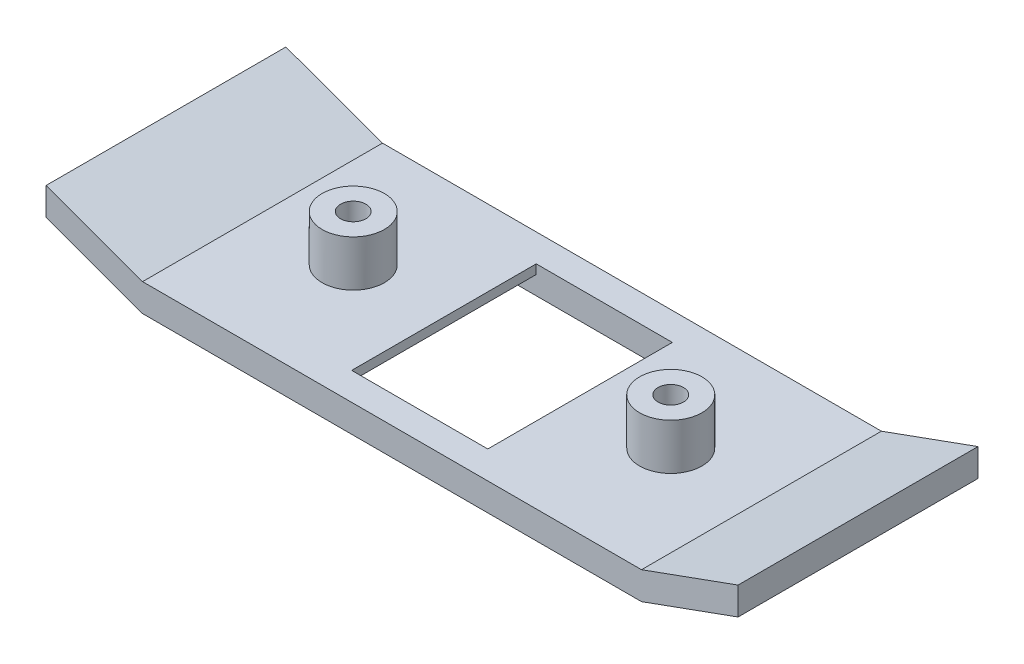
ISO-10303-21;
HEADER;
FILE_DESCRIPTION(('STEP AP214'),'2;1');
FILE_NAME('part.step','',(''),(''),'','','');
FILE_SCHEMA(('AUTOMOTIVE_DESIGN { 1 0 10303 214 1 1 1 1 }'));
ENDSEC;
DATA;
#1=APPLICATION_CONTEXT('core data for automotive mechanical design processes');
#2=APPLICATION_PROTOCOL_DEFINITION('international standard','automotive_design',2000,#1);
#3=PRODUCT_CONTEXT('',#1,'mechanical');
#4=PRODUCT('Part','Part','',(#3));
#5=PRODUCT_RELATED_PRODUCT_CATEGORY('part','',(#4));
#6=PRODUCT_DEFINITION_FORMATION('','',#4);
#7=PRODUCT_DEFINITION_CONTEXT('part definition',#1,'design');
#8=PRODUCT_DEFINITION('design','',#6,#7);
#9=PRODUCT_DEFINITION_SHAPE('','',#8);
#10=(LENGTH_UNIT() NAMED_UNIT(*) SI_UNIT(.MILLI.,.METRE.));
#11=(NAMED_UNIT(*) PLANE_ANGLE_UNIT() SI_UNIT($,.RADIAN.));
#12=(NAMED_UNIT(*) SI_UNIT($,.STERADIAN.) SOLID_ANGLE_UNIT());
#13=UNCERTAINTY_MEASURE_WITH_UNIT(LENGTH_MEASURE(1.E-05),#10,'distance_accuracy_value','');
#14=(GEOMETRIC_REPRESENTATION_CONTEXT(3) GLOBAL_UNCERTAINTY_ASSIGNED_CONTEXT((#13)) GLOBAL_UNIT_ASSIGNED_CONTEXT((#10,
#11,#12)) REPRESENTATION_CONTEXT('',''));
#15=CARTESIAN_POINT('',(0.,0.,0.));
#16=DIRECTION('',(0.,0.,1.));
#17=DIRECTION('',(1.,0.,0.));
#18=AXIS2_PLACEMENT_3D('',#15,#16,#17);
#19=CARTESIAN_POINT('',(-27.035253751749,3.,102.306789568928));
#20=DIRECTION('',(0.,-1.,0.));
#21=DIRECTION('',(0.,0.,-1.));
#22=AXIS2_PLACEMENT_3D('',#19,#20,#21);
#23=PLANE('',#22);
#24=DIRECTION('',(0.,0.,1.));
#25=VECTOR('',#24,1.);
#26=CARTESIAN_POINT('',(7.37500000000002,3.,102.306789568928));
#27=LINE('',#26,#25);
#28=CARTESIAN_POINT('',(7.37500000000002,3.,3.));
#29=VERTEX_POINT('',#28);
#30=CARTESIAN_POINT('',(7.37500000000002,3.,23.));
#31=VERTEX_POINT('',#30);
#32=EDGE_CURVE('E395',#29,#31,#27,.T.);
#33=ORIENTED_EDGE('',*,*,#32,.T.);
#34=DIRECTION('',(-1.,0.,0.));
#35=VECTOR('',#34,1.);
#36=CARTESIAN_POINT('',(-27.035253751749,3.,23.));
#37=LINE('',#36,#35);
#38=CARTESIAN_POINT('',(-7.37499999999998,3.,23.));
#39=VERTEX_POINT('',#38);
#40=EDGE_CURVE('E170',#31,#39,#37,.T.);
#41=ORIENTED_EDGE('',*,*,#40,.T.);
#42=DIRECTION('',(0.,0.,-1.));
#43=VECTOR('',#42,1.);
#44=CARTESIAN_POINT('',(-7.37499999999998,3.,102.306789568928));
#45=LINE('',#44,#43);
#46=CARTESIAN_POINT('',(-7.37499999999998,3.,3.));
#47=VERTEX_POINT('',#46);
#48=EDGE_CURVE('E392',#39,#47,#45,.T.);
#49=ORIENTED_EDGE('',*,*,#48,.T.);
#50=DIRECTION('',(1.,0.,0.));
#51=VECTOR('',#50,1.);
#52=CARTESIAN_POINT('',(-27.035253751749,3.,3.));
#53=LINE('',#52,#51);
#54=EDGE_CURVE('E150',#47,#29,#53,.T.);
#55=ORIENTED_EDGE('',*,*,#54,.T.);
#56=EDGE_LOOP('',(#33,#41,#49,#55));
#57=FACE_BOUND('',#56,.T.);
#58=DIRECTION('',(0.,0.,-1.));
#59=VECTOR('',#58,1.);
#60=CARTESIAN_POINT('',(-27.035253751749,3.,102.306789568928));
#61=LINE('',#60,#59);
#62=CARTESIAN_POINT('',(-27.035253751749,3.,26.));
#63=VERTEX_POINT('',#62);
#64=CARTESIAN_POINT('',(-27.035253751749,3.,0.));
#65=VERTEX_POINT('',#64);
#66=EDGE_CURVE('E238',#63,#65,#61,.T.);
#67=ORIENTED_EDGE('',*,*,#66,.F.);
#68=DIRECTION('',(1.,0.,0.));
#69=VECTOR('',#68,1.);
#70=CARTESIAN_POINT('',(-27.035253751749,3.,26.));
#71=LINE('',#70,#69);
#72=CARTESIAN_POINT('',(27.035253751749,3.,26.));
#73=VERTEX_POINT('',#72);
#74=EDGE_CURVE('E191',#63,#73,#71,.T.);
#75=ORIENTED_EDGE('',*,*,#74,.T.);
#76=DIRECTION('',(0.,0.,-1.));
#77=VECTOR('',#76,1.);
#78=CARTESIAN_POINT('',(27.035253751749,3.,102.306789568928));
#79=LINE('',#78,#77);
#80=CARTESIAN_POINT('',(27.035253751749,3.,0.));
#81=VERTEX_POINT('',#80);
#82=EDGE_CURVE('E240',#73,#81,#79,.T.);
#83=ORIENTED_EDGE('',*,*,#82,.T.);
#84=DIRECTION('',(-1.,0.,0.));
#85=VECTOR('',#84,1.);
#86=CARTESIAN_POINT('',(-27.035253751749,3.,0.));
#87=LINE('',#86,#85);
#88=EDGE_CURVE('E225',#81,#65,#87,.T.);
#89=ORIENTED_EDGE('',*,*,#88,.T.);
#90=EDGE_LOOP('',(#67,#75,#83,#89));
#91=FACE_BOUND('',#90,.T.);
#92=CARTESIAN_POINT('',(-17.2051268758745,3.,13.));
#93=DIRECTION('',(0.,-1.,0.));
#94=DIRECTION('',(0.,0.,-1.));
#95=AXIS2_PLACEMENT_3D('',#92,#93,#94);
#96=CIRCLE('',#95,3.375);
#97=CARTESIAN_POINT('',(-17.2051268758745,3.,9.62500000000001));
#98=VERTEX_POINT('',#97);
#99=EDGE_CURVE('E41',#98,#98,#96,.F.);
#100=ORIENTED_EDGE('',*,*,#99,.F.);
#101=EDGE_LOOP('',(#100));
#102=FACE_BOUND('',#101,.T.);
#103=CARTESIAN_POINT('',(17.2051268758745,3.,13.));
#104=DIRECTION('',(0.,-1.,0.));
#105=DIRECTION('',(0.,0.,-1.));
#106=AXIS2_PLACEMENT_3D('',#103,#104,#105);
#107=CIRCLE('',#106,3.375);
#108=CARTESIAN_POINT('',(17.2051268758745,3.,9.625));
#109=VERTEX_POINT('',#108);
#110=EDGE_CURVE('E11',#109,#109,#107,.F.);
#111=ORIENTED_EDGE('',*,*,#110,.F.);
#112=EDGE_LOOP('',(#111));
#113=FACE_BOUND('',#112,.T.);
#114=ADVANCED_FACE('F33',(#57,#91,#102,#113),#23,.F.);
#115=CARTESIAN_POINT('',(-37.5,2.,23.));
#116=DIRECTION('',(0.,1.,0.));
#117=DIRECTION('',(0.,0.,1.));
#118=AXIS2_PLACEMENT_3D('',#115,#116,#117);
#119=PLANE('',#118);
#120=DIRECTION('',(-1.,0.,0.));
#121=VECTOR('',#120,1.);
#122=CARTESIAN_POINT('',(-37.5,2.,23.));
#123=LINE('',#122,#121);
#124=CARTESIAN_POINT('',(32.5566402764816,2.,23.));
#125=VERTEX_POINT('',#124);
#126=CARTESIAN_POINT('',(7.37500000000002,2.,23.));
#127=VERTEX_POINT('',#126);
#128=EDGE_CURVE('E168',#125,#127,#123,.T.);
#129=ORIENTED_EDGE('',*,*,#128,.T.);
#130=DIRECTION('',(0.,0.,1.));
#131=VECTOR('',#130,1.);
#132=CARTESIAN_POINT('',(7.37500000000002,2.,23.));
#133=LINE('',#132,#131);
#134=CARTESIAN_POINT('',(7.37500000000002,2.,3.));
#135=VERTEX_POINT('',#134);
#136=EDGE_CURVE('E158',#135,#127,#133,.T.);
#137=ORIENTED_EDGE('',*,*,#136,.F.);
#138=DIRECTION('',(1.,0.,0.));
#139=VECTOR('',#138,1.);
#140=CARTESIAN_POINT('',(37.5,2.,3.));
#141=LINE('',#140,#139);
#142=CARTESIAN_POINT('',(32.5566402764816,2.,3.));
#143=VERTEX_POINT('',#142);
#144=EDGE_CURVE('E166',#135,#143,#141,.T.);
#145=ORIENTED_EDGE('',*,*,#144,.T.);
#146=DIRECTION('',(0.,0.,-1.));
#147=VECTOR('',#146,1.);
#148=CARTESIAN_POINT('',(32.5566402764816,2.,102.306789568928));
#149=LINE('',#148,#147);
#150=EDGE_CURVE('E175',#125,#143,#149,.T.);
#151=ORIENTED_EDGE('',*,*,#150,.F.);
#152=EDGE_LOOP('',(#129,#137,#145,#151));
#153=FACE_BOUND('',#152,.T.);
#154=ADVANCED_FACE('F267',(#153),#119,.F.);
#155=CARTESIAN_POINT('',(27.035253751749,0.,102.306789568928));
#156=DIRECTION('',(0.,1.,0.));
#157=DIRECTION('',(0.,0.,1.));
#158=AXIS2_PLACEMENT_3D('',#155,#156,#157);
#159=PLANE('',#158);
#160=DIRECTION('',(0.,0.,-1.));
#161=VECTOR('',#160,1.);
#162=CARTESIAN_POINT('',(27.035253751749,0.,102.306789568928));
#163=LINE('',#162,#161);
#164=CARTESIAN_POINT('',(27.035253751749,0.,3.));
#165=VERTEX_POINT('',#164);
#166=CARTESIAN_POINT('',(27.035253751749,0.,0.));
#167=VERTEX_POINT('',#166);
#168=EDGE_CURVE('E246',#165,#167,#163,.T.);
#169=ORIENTED_EDGE('',*,*,#168,.F.);
#170=DIRECTION('',(1.,0.,0.));
#171=VECTOR('',#170,1.);
#172=CARTESIAN_POINT('',(-37.5,0.,3.));
#173=LINE('',#172,#171);
#174=CARTESIAN_POINT('',(-27.035253751749,0.,3.));
#175=VERTEX_POINT('',#174);
#176=EDGE_CURVE('E180',#175,#165,#173,.T.);
#177=ORIENTED_EDGE('',*,*,#176,.F.);
#178=DIRECTION('',(0.,0.,-1.));
#179=VECTOR('',#178,1.);
#180=CARTESIAN_POINT('',(-27.035253751749,0.,102.306789568928));
#181=LINE('',#180,#179);
#182=CARTESIAN_POINT('',(-27.035253751749,0.,0.));
#183=VERTEX_POINT('',#182);
#184=EDGE_CURVE('E250',#175,#183,#181,.T.);
#185=ORIENTED_EDGE('',*,*,#184,.T.);
#186=DIRECTION('',(1.,0.,0.));
#187=VECTOR('',#186,1.);
#188=CARTESIAN_POINT('',(27.035253751749,0.,0.));
#189=LINE('',#188,#187);
#190=EDGE_CURVE('E213',#183,#167,#189,.T.);
#191=ORIENTED_EDGE('',*,*,#190,.T.);
#192=EDGE_LOOP('',(#169,#177,#185,#191));
#193=FACE_BOUND('',#192,.T.);
#194=ADVANCED_FACE('F323',(#193),#159,.F.);
#195=CARTESIAN_POINT('',(-37.5,3.79062259139986,0.));
#196=DIRECTION('',(0.,0.,-1.));
#197=DIRECTION('',(-1.,0.,0.));
#198=AXIS2_PLACEMENT_3D('',#195,#196,#197);
#199=PLANE('',#198);
#200=DIRECTION('',(0.940218019796409,-0.340573156972361,0.));
#201=VECTOR('',#200,1.);
#202=CARTESIAN_POINT('',(-27.035253751749,0.,0.));
#203=LINE('',#202,#201);
#204=CARTESIAN_POINT('',(-37.5,3.79062259139986,0.));
#205=VERTEX_POINT('',#204);
#206=EDGE_CURVE('E187',#205,#183,#203,.T.);
#207=ORIENTED_EDGE('',*,*,#206,.F.);
#208=DIRECTION('',(0.,-1.,0.));
#209=VECTOR('',#208,1.);
#210=CARTESIAN_POINT('',(-37.5,3.79062259139986,0.));
#211=LINE('',#210,#209);
#212=CARTESIAN_POINT('',(-37.5,6.79062259139985,0.));
#213=VERTEX_POINT('',#212);
#214=EDGE_CURVE('E231',#213,#205,#211,.T.);
#215=ORIENTED_EDGE('',*,*,#214,.F.);
#216=DIRECTION('',(-0.940218019796409,0.34057315697236,0.));
#217=VECTOR('',#216,1.);
#218=CARTESIAN_POINT('',(-37.5,6.79062259139985,0.));
#219=LINE('',#218,#217);
#220=EDGE_CURVE('E228',#65,#213,#219,.T.);
#221=ORIENTED_EDGE('',*,*,#220,.F.);
#222=ORIENTED_EDGE('',*,*,#88,.F.);
#223=DIRECTION('',(-0.940218019796409,-0.34057315697236,0.));
#224=VECTOR('',#223,1.);
#225=CARTESIAN_POINT('',(37.5,6.79062259139985,0.));
#226=LINE('',#225,#224);
#227=CARTESIAN_POINT('',(37.5,6.79062259139985,0.));
#228=VERTEX_POINT('',#227);
#229=EDGE_CURVE('E222',#228,#81,#226,.T.);
#230=ORIENTED_EDGE('',*,*,#229,.F.);
#231=DIRECTION('',(0.,1.,0.));
#232=VECTOR('',#231,1.);
#233=CARTESIAN_POINT('',(37.5,3.79062259139986,0.));
#234=LINE('',#233,#232);
#235=CARTESIAN_POINT('',(37.5,3.79062259139986,0.));
#236=VERTEX_POINT('',#235);
#237=EDGE_CURVE('E219',#236,#228,#234,.T.);
#238=ORIENTED_EDGE('',*,*,#237,.F.);
#239=DIRECTION('',(0.940218019796409,0.340573156972361,0.));
#240=VECTOR('',#239,1.);
#241=CARTESIAN_POINT('',(27.035253751749,0.,0.));
#242=LINE('',#241,#240);
#243=EDGE_CURVE('E216',#167,#236,#242,.T.);
#244=ORIENTED_EDGE('',*,*,#243,.F.);
#245=ORIENTED_EDGE('',*,*,#190,.F.);
#246=EDGE_LOOP('',(#207,#215,#221,#222,#230,#238,#244,#245));
#247=FACE_BOUND('',#246,.T.);
#248=ADVANCED_FACE('F319',(#247),#199,.T.);
#249=CARTESIAN_POINT('',(-37.5,3.79062259139986,102.306789568928));
#250=DIRECTION('',(1.,0.,0.));
#251=DIRECTION('',(0.,0.,-1.));
#252=AXIS2_PLACEMENT_3D('',#249,#250,#251);
#253=PLANE('',#252);
#254=DIRECTION('',(0.,0.,-1.));
#255=VECTOR('',#254,1.);
#256=CARTESIAN_POINT('',(-37.5,3.79062259139986,102.306789568928));
#257=LINE('',#256,#255);
#258=CARTESIAN_POINT('',(-37.5,3.79062259139986,26.));
#259=VERTEX_POINT('',#258);
#260=EDGE_CURVE('E234',#259,#205,#257,.T.);
#261=ORIENTED_EDGE('',*,*,#260,.F.);
#262=DIRECTION('',(0.,1.,0.));
#263=VECTOR('',#262,1.);
#264=CARTESIAN_POINT('',(-37.5,3.79062259139986,26.));
#265=LINE('',#264,#263);
#266=CARTESIAN_POINT('',(-37.5,6.79062259139985,26.));
#267=VERTEX_POINT('',#266);
#268=EDGE_CURVE('E192',#259,#267,#265,.T.);
#269=ORIENTED_EDGE('',*,*,#268,.T.);
#270=DIRECTION('',(0.,0.,-1.));
#271=VECTOR('',#270,1.);
#272=CARTESIAN_POINT('',(-37.5,6.79062259139985,102.306789568928));
#273=LINE('',#272,#271);
#274=EDGE_CURVE('E236',#267,#213,#273,.T.);
#275=ORIENTED_EDGE('',*,*,#274,.T.);
#276=ORIENTED_EDGE('',*,*,#214,.T.);
#277=EDGE_LOOP('',(#261,#269,#275,#276));
#278=FACE_BOUND('',#277,.T.);
#279=ADVANCED_FACE('F322',(#278),#253,.F.);
#280=CARTESIAN_POINT('',(-37.5,6.79062259139985,102.306789568928));
#281=DIRECTION('',(-0.34057315697236,-0.940218019796409,0.));
#282=DIRECTION('',(0.940218019796409,-0.34057315697236,0.));
#283=AXIS2_PLACEMENT_3D('',#280,#281,#282);
#284=PLANE('',#283);
#285=ORIENTED_EDGE('',*,*,#274,.F.);
#286=DIRECTION('',(0.940218019796409,-0.34057315697236,0.));
#287=VECTOR('',#286,1.);
#288=CARTESIAN_POINT('',(-37.5,6.79062259139985,26.));
#289=LINE('',#288,#287);
#290=EDGE_CURVE('E188',#267,#63,#289,.T.);
#291=ORIENTED_EDGE('',*,*,#290,.T.);
#292=ORIENTED_EDGE('',*,*,#66,.T.);
#293=ORIENTED_EDGE('',*,*,#220,.T.);
#294=EDGE_LOOP('',(#285,#291,#292,#293));
#295=FACE_BOUND('',#294,.T.);
#296=ADVANCED_FACE('F327',(#295),#284,.F.);
#297=CARTESIAN_POINT('',(37.5,6.79062259139985,102.306789568928));
#298=DIRECTION('',(0.34057315697236,-0.940218019796409,0.));
#299=DIRECTION('',(0.940218019796409,0.34057315697236,0.));
#300=AXIS2_PLACEMENT_3D('',#297,#298,#299);
#301=PLANE('',#300);
#302=ORIENTED_EDGE('',*,*,#82,.F.);
#303=DIRECTION('',(0.940218019796409,0.34057315697236,0.));
#304=VECTOR('',#303,1.);
#305=CARTESIAN_POINT('',(37.5,6.79062259139985,26.));
#306=LINE('',#305,#304);
#307=CARTESIAN_POINT('',(37.5,6.79062259139985,26.));
#308=VERTEX_POINT('',#307);
#309=EDGE_CURVE('E195',#73,#308,#306,.T.);
#310=ORIENTED_EDGE('',*,*,#309,.T.);
#311=DIRECTION('',(0.,0.,-1.));
#312=VECTOR('',#311,1.);
#313=CARTESIAN_POINT('',(37.5,6.79062259139985,102.306789568928));
#314=LINE('',#313,#312);
#315=EDGE_CURVE('E242',#308,#228,#314,.T.);
#316=ORIENTED_EDGE('',*,*,#315,.T.);
#317=ORIENTED_EDGE('',*,*,#229,.T.);
#318=EDGE_LOOP('',(#302,#310,#316,#317));
#319=FACE_BOUND('',#318,.T.);
#320=ADVANCED_FACE('F330',(#319),#301,.F.);
#321=CARTESIAN_POINT('',(37.5,3.79062259139986,102.306789568928));
#322=DIRECTION('',(-1.,0.,0.));
#323=DIRECTION('',(0.,0.,1.));
#324=AXIS2_PLACEMENT_3D('',#321,#322,#323);
#325=PLANE('',#324);
#326=ORIENTED_EDGE('',*,*,#315,.F.);
#327=DIRECTION('',(0.,-1.,0.));
#328=VECTOR('',#327,1.);
#329=CARTESIAN_POINT('',(37.5,3.79062259139986,26.));
#330=LINE('',#329,#328);
#331=CARTESIAN_POINT('',(37.5,3.79062259139986,26.));
#332=VERTEX_POINT('',#331);
#333=EDGE_CURVE('E198',#308,#332,#330,.T.);
#334=ORIENTED_EDGE('',*,*,#333,.T.);
#335=DIRECTION('',(0.,0.,-1.));
#336=VECTOR('',#335,1.);
#337=CARTESIAN_POINT('',(37.5,3.79062259139986,102.306789568928));
#338=LINE('',#337,#336);
#339=EDGE_CURVE('E244',#332,#236,#338,.T.);
#340=ORIENTED_EDGE('',*,*,#339,.T.);
#341=ORIENTED_EDGE('',*,*,#237,.T.);
#342=EDGE_LOOP('',(#326,#334,#340,#341));
#343=FACE_BOUND('',#342,.T.);
#344=ADVANCED_FACE('F337',(#343),#325,.F.);
#345=CARTESIAN_POINT('',(27.035253751749,0.,102.306789568928));
#346=DIRECTION('',(-0.340573156972361,0.940218019796409,0.));
#347=DIRECTION('',(-0.940218019796409,-0.340573156972361,0.));
#348=AXIS2_PLACEMENT_3D('',#345,#346,#347);
#349=PLANE('',#348);
#350=DIRECTION('',(0.940218019796409,0.340573156972361,0.));
#351=VECTOR('',#350,1.);
#352=CARTESIAN_POINT('',(27.035253751749,0.,23.));
#353=LINE('',#352,#351);
#354=CARTESIAN_POINT('',(27.035253751749,0.,23.));
#355=VERTEX_POINT('',#354);
#356=EDGE_CURVE('E182',#355,#125,#353,.T.);
#357=ORIENTED_EDGE('',*,*,#356,.T.);
#358=ORIENTED_EDGE('',*,*,#150,.T.);
#359=DIRECTION('',(-0.940218019796409,-0.340573156972361,0.));
#360=VECTOR('',#359,1.);
#361=CARTESIAN_POINT('',(27.035253751749,0.,3.));
#362=LINE('',#361,#360);
#363=EDGE_CURVE('E184',#143,#165,#362,.T.);
#364=ORIENTED_EDGE('',*,*,#363,.T.);
#365=ORIENTED_EDGE('',*,*,#168,.T.);
#366=ORIENTED_EDGE('',*,*,#243,.T.);
#367=ORIENTED_EDGE('',*,*,#339,.F.);
#368=DIRECTION('',(-0.940218019796409,-0.340573156972361,0.));
#369=VECTOR('',#368,1.);
#370=CARTESIAN_POINT('',(27.035253751749,0.,26.));
#371=LINE('',#370,#369);
#372=CARTESIAN_POINT('',(27.035253751749,0.,26.));
#373=VERTEX_POINT('',#372);
#374=EDGE_CURVE('E201',#332,#373,#371,.T.);
#375=ORIENTED_EDGE('',*,*,#374,.T.);
#376=EDGE_CURVE('E247',#373,#355,#163,.T.);
#377=ORIENTED_EDGE('',*,*,#376,.T.);
#378=EDGE_LOOP('',(#357,#358,#364,#365,#366,#367,#375,#377));
#379=FACE_BOUND('',#378,.T.);
#380=ADVANCED_FACE('F341',(#379),#349,.F.);
#381=CARTESIAN_POINT('',(-27.035253751749,0.,26.));
#382=VERTEX_POINT('',#381);
#383=CARTESIAN_POINT('',(-27.035253751749,0.,23.));
#384=VERTEX_POINT('',#383);
#385=EDGE_CURVE('E251',#382,#384,#181,.T.);
#386=ORIENTED_EDGE('',*,*,#385,.T.);
#387=DIRECTION('',(-1.,0.,0.));
#388=VECTOR('',#387,1.);
#389=CARTESIAN_POINT('',(37.5,0.,23.));
#390=LINE('',#389,#388);
#391=EDGE_CURVE('E178',#355,#384,#390,.T.);
#392=ORIENTED_EDGE('',*,*,#391,.F.);
#393=ORIENTED_EDGE('',*,*,#376,.F.);
#394=DIRECTION('',(-1.,0.,0.));
#395=VECTOR('',#394,1.);
#396=CARTESIAN_POINT('',(27.035253751749,0.,26.));
#397=LINE('',#396,#395);
#398=EDGE_CURVE('E204',#373,#382,#397,.T.);
#399=ORIENTED_EDGE('',*,*,#398,.T.);
#400=EDGE_LOOP('',(#386,#392,#393,#399));
#401=FACE_BOUND('',#400,.T.);
#402=ADVANCED_FACE('F344',(#401),#159,.F.);
#403=CARTESIAN_POINT('',(-27.035253751749,0.,102.306789568928));
#404=DIRECTION('',(0.340573156972361,0.940218019796409,0.));
#405=DIRECTION('',(-0.940218019796409,0.340573156972361,0.));
#406=AXIS2_PLACEMENT_3D('',#403,#404,#405);
#407=PLANE('',#406);
#408=DIRECTION('',(0.,0.,1.));
#409=VECTOR('',#408,1.);
#410=CARTESIAN_POINT('',(-32.5566402764816,2.,102.306789568928));
#411=LINE('',#410,#409);
#412=CARTESIAN_POINT('',(-32.5566402764816,2.,3.));
#413=VERTEX_POINT('',#412);
#414=CARTESIAN_POINT('',(-32.5566402764816,2.,23.));
#415=VERTEX_POINT('',#414);
#416=EDGE_CURVE('E164',#413,#415,#411,.T.);
#417=ORIENTED_EDGE('',*,*,#416,.T.);
#418=DIRECTION('',(0.940218019796409,-0.340573156972361,0.));
#419=VECTOR('',#418,1.);
#420=CARTESIAN_POINT('',(-27.035253751749,0.,23.));
#421=LINE('',#420,#419);
#422=EDGE_CURVE('E210',#415,#384,#421,.T.);
#423=ORIENTED_EDGE('',*,*,#422,.T.);
#424=ORIENTED_EDGE('',*,*,#385,.F.);
#425=DIRECTION('',(-0.940218019796409,0.340573156972361,0.));
#426=VECTOR('',#425,1.);
#427=CARTESIAN_POINT('',(-27.035253751749,0.,26.));
#428=LINE('',#427,#426);
#429=EDGE_CURVE('E207',#382,#259,#428,.T.);
#430=ORIENTED_EDGE('',*,*,#429,.T.);
#431=ORIENTED_EDGE('',*,*,#260,.T.);
#432=ORIENTED_EDGE('',*,*,#206,.T.);
#433=ORIENTED_EDGE('',*,*,#184,.F.);
#434=DIRECTION('',(-0.940218019796409,0.340573156972361,0.));
#435=VECTOR('',#434,1.);
#436=CARTESIAN_POINT('',(-27.035253751749,0.,3.));
#437=LINE('',#436,#435);
#438=EDGE_CURVE('E258',#175,#413,#437,.T.);
#439=ORIENTED_EDGE('',*,*,#438,.T.);
#440=EDGE_LOOP('',(#417,#423,#424,#430,#431,#432,#433,#439));
#441=FACE_BOUND('',#440,.T.);
#442=ADVANCED_FACE('F35',(#441),#407,.F.);
#443=CARTESIAN_POINT('',(-0.403344832786919,0.,26.));
#444=DIRECTION('',(0.,0.,-1.));
#445=DIRECTION('',(0.,1.,0.));
#446=AXIS2_PLACEMENT_3D('',#443,#444,#445);
#447=PLANE('',#446);
#448=ORIENTED_EDGE('',*,*,#398,.F.);
#449=ORIENTED_EDGE('',*,*,#374,.F.);
#450=ORIENTED_EDGE('',*,*,#333,.F.);
#451=ORIENTED_EDGE('',*,*,#309,.F.);
#452=ORIENTED_EDGE('',*,*,#74,.F.);
#453=ORIENTED_EDGE('',*,*,#290,.F.);
#454=ORIENTED_EDGE('',*,*,#268,.F.);
#455=ORIENTED_EDGE('',*,*,#429,.F.);
#456=EDGE_LOOP('',(#448,#449,#450,#451,#452,#453,#454,#455));
#457=FACE_BOUND('',#456,.T.);
#458=ADVANCED_FACE('F312',(#457),#447,.F.);
#459=CARTESIAN_POINT('',(-37.5,1.,3.));
#460=DIRECTION('',(0.,0.,-1.));
#461=DIRECTION('',(-1.,0.,0.));
#462=AXIS2_PLACEMENT_3D('',#459,#460,#461);
#463=PLANE('',#462);
#464=ORIENTED_EDGE('',*,*,#363,.F.);
#465=ORIENTED_EDGE('',*,*,#144,.F.);
#466=DIRECTION('',(0.,-1.,0.));
#467=VECTOR('',#466,1.);
#468=CARTESIAN_POINT('',(7.37500000000002,6.79062259139985,3.));
#469=LINE('',#468,#467);
#470=EDGE_CURVE('E152',#29,#135,#469,.T.);
#471=ORIENTED_EDGE('',*,*,#470,.F.);
#472=ORIENTED_EDGE('',*,*,#54,.F.);
#473=DIRECTION('',(0.,-1.,0.));
#474=VECTOR('',#473,1.);
#475=CARTESIAN_POINT('',(-7.37499999999998,6.79062259139985,3.));
#476=LINE('',#475,#474);
#477=CARTESIAN_POINT('',(-7.37499999999998,2.,3.));
#478=VERTEX_POINT('',#477);
#479=EDGE_CURVE('E48',#47,#478,#476,.T.);
#480=ORIENTED_EDGE('',*,*,#479,.T.);
#481=EDGE_CURVE('E147',#413,#478,#141,.T.);
#482=ORIENTED_EDGE('',*,*,#481,.F.);
#483=ORIENTED_EDGE('',*,*,#438,.F.);
#484=ORIENTED_EDGE('',*,*,#176,.T.);
#485=EDGE_LOOP('',(#464,#465,#471,#472,#480,#482,#483,#484));
#486=FACE_BOUND('',#485,.T.);
#487=ADVANCED_FACE('F145',(#486),#463,.F.);
#488=CARTESIAN_POINT('',(37.5,1.,23.));
#489=DIRECTION('',(0.,0.,1.));
#490=DIRECTION('',(1.,0.,0.));
#491=AXIS2_PLACEMENT_3D('',#488,#489,#490);
#492=PLANE('',#491);
#493=ORIENTED_EDGE('',*,*,#391,.T.);
#494=ORIENTED_EDGE('',*,*,#422,.F.);
#495=CARTESIAN_POINT('',(-7.37499999999998,2.,23.));
#496=VERTEX_POINT('',#495);
#497=EDGE_CURVE('E165',#496,#415,#123,.T.);
#498=ORIENTED_EDGE('',*,*,#497,.F.);
#499=DIRECTION('',(0.,-1.,0.));
#500=VECTOR('',#499,1.);
#501=CARTESIAN_POINT('',(-7.37499999999998,6.79062259139985,23.));
#502=LINE('',#501,#500);
#503=EDGE_CURVE('E53',#39,#496,#502,.T.);
#504=ORIENTED_EDGE('',*,*,#503,.F.);
#505=ORIENTED_EDGE('',*,*,#40,.F.);
#506=DIRECTION('',(0.,-1.,0.));
#507=VECTOR('',#506,1.);
#508=CARTESIAN_POINT('',(7.37500000000002,6.79062259139985,23.));
#509=LINE('',#508,#507);
#510=EDGE_CURVE('E390',#31,#127,#509,.T.);
#511=ORIENTED_EDGE('',*,*,#510,.T.);
#512=ORIENTED_EDGE('',*,*,#128,.F.);
#513=ORIENTED_EDGE('',*,*,#356,.F.);
#514=EDGE_LOOP('',(#493,#494,#498,#504,#505,#511,#512,#513));
#515=FACE_BOUND('',#514,.T.);
#516=ADVANCED_FACE('F309',(#515),#492,.F.);
#517=ORIENTED_EDGE('',*,*,#481,.T.);
#518=DIRECTION('',(0.,0.,-1.));
#519=VECTOR('',#518,1.);
#520=CARTESIAN_POINT('',(-7.37499999999998,2.,3.));
#521=LINE('',#520,#519);
#522=EDGE_CURVE('E154',#496,#478,#521,.T.);
#523=ORIENTED_EDGE('',*,*,#522,.F.);
#524=ORIENTED_EDGE('',*,*,#497,.T.);
#525=ORIENTED_EDGE('',*,*,#416,.F.);
#526=EDGE_LOOP('',(#517,#523,#524,#525));
#527=FACE_BOUND('',#526,.T.);
#528=ADVANCED_FACE('F162',(#527),#119,.F.);
#529=CARTESIAN_POINT('',(7.37500000000002,6.79062259139985,23.));
#530=DIRECTION('',(1.,0.,0.));
#531=DIRECTION('',(0.,0.,-1.));
#532=AXIS2_PLACEMENT_3D('',#529,#530,#531);
#533=PLANE('',#532);
#534=ORIENTED_EDGE('',*,*,#470,.T.);
#535=ORIENTED_EDGE('',*,*,#136,.T.);
#536=ORIENTED_EDGE('',*,*,#510,.F.);
#537=ORIENTED_EDGE('',*,*,#32,.F.);
#538=EDGE_LOOP('',(#534,#535,#536,#537));
#539=FACE_BOUND('',#538,.T.);
#540=ADVANCED_FACE('F301',(#539),#533,.F.);
#541=CARTESIAN_POINT('',(-7.37499999999998,6.79062259139985,3.));
#542=DIRECTION('',(-1.,0.,0.));
#543=DIRECTION('',(0.,0.,1.));
#544=AXIS2_PLACEMENT_3D('',#541,#542,#543);
#545=PLANE('',#544);
#546=ORIENTED_EDGE('',*,*,#503,.T.);
#547=ORIENTED_EDGE('',*,*,#522,.T.);
#548=ORIENTED_EDGE('',*,*,#479,.F.);
#549=ORIENTED_EDGE('',*,*,#48,.F.);
#550=EDGE_LOOP('',(#546,#547,#548,#549));
#551=FACE_BOUND('',#550,.T.);
#552=ADVANCED_FACE('F155',(#551),#545,.F.);
#553=CARTESIAN_POINT('',(-17.2051268758745,8.,13.));
#554=DIRECTION('',(0.,1.,0.));
#555=DIRECTION('',(0.,0.,1.));
#556=AXIS2_PLACEMENT_3D('',#553,#554,#555);
#557=PLANE('',#556);
#558=CARTESIAN_POINT('',(-17.2051268758745,8.,13.));
#559=DIRECTION('',(0.,1.,0.));
#560=DIRECTION('',(0.,0.,1.));
#561=AXIS2_PLACEMENT_3D('',#558,#559,#560);
#562=CIRCLE('',#561,3.375);
#563=CARTESIAN_POINT('',(-17.2051268758745,8.,16.375));
#564=VERTEX_POINT('',#563);
#565=EDGE_CURVE('E159',#564,#564,#562,.T.);
#566=ORIENTED_EDGE('',*,*,#565,.T.);
#567=EDGE_LOOP('',(#566));
#568=FACE_BOUND('',#567,.T.);
#569=CARTESIAN_POINT('',(-17.2051268758745,8.,13.));
#570=DIRECTION('',(0.,1.,0.));
#571=DIRECTION('',(0.,0.,1.));
#572=AXIS2_PLACEMENT_3D('',#569,#570,#571);
#573=CIRCLE('',#572,1.375);
#574=CARTESIAN_POINT('',(-17.2051268758745,8.,14.375));
#575=VERTEX_POINT('',#574);
#576=EDGE_CURVE('E400',#575,#575,#573,.T.);
#577=ORIENTED_EDGE('',*,*,#576,.F.);
#578=EDGE_LOOP('',(#577));
#579=FACE_BOUND('',#578,.T.);
#580=ADVANCED_FACE('F294',(#568,#579),#557,.T.);
#581=CARTESIAN_POINT('',(-17.2051268758745,8.,13.));
#582=DIRECTION('',(0.,-1.,0.));
#583=DIRECTION('',(0.,0.,-1.));
#584=AXIS2_PLACEMENT_3D('',#581,#582,#583);
#585=CYLINDRICAL_SURFACE('',#584,3.375);
#586=ORIENTED_EDGE('',*,*,#565,.F.);
#587=EDGE_LOOP('',(#586));
#588=FACE_BOUND('',#587,.T.);
#589=ORIENTED_EDGE('',*,*,#99,.T.);
#590=EDGE_LOOP('',(#589));
#591=FACE_BOUND('',#590,.T.);
#592=ADVANCED_FACE('F263',(#588,#591),#585,.T.);
#593=CARTESIAN_POINT('',(-17.2051268758745,8.,13.));
#594=DIRECTION('',(0.,-1.,0.));
#595=DIRECTION('',(0.,0.,-1.));
#596=AXIS2_PLACEMENT_3D('',#593,#594,#595);
#597=CYLINDRICAL_SURFACE('',#596,1.375);
#598=ORIENTED_EDGE('',*,*,#576,.T.);
#599=EDGE_LOOP('',(#598));
#600=FACE_BOUND('',#599,.T.);
#601=CARTESIAN_POINT('',(-17.2051268758745,3.,13.));
#602=DIRECTION('',(0.,1.,0.));
#603=DIRECTION('',(0.,0.,1.));
#604=AXIS2_PLACEMENT_3D('',#601,#602,#603);
#605=CIRCLE('',#604,1.375);
#606=CARTESIAN_POINT('',(-17.2051268758745,3.,14.375));
#607=VERTEX_POINT('',#606);
#608=EDGE_CURVE('E401',#607,#607,#605,.T.);
#609=ORIENTED_EDGE('',*,*,#608,.F.);
#610=EDGE_LOOP('',(#609));
#611=FACE_BOUND('',#610,.T.);
#612=ADVANCED_FACE('F290',(#600,#611),#597,.F.);
#613=ORIENTED_EDGE('',*,*,#608,.T.);
#614=EDGE_LOOP('',(#613));
#615=FACE_BOUND('',#614,.T.);
#616=ADVANCED_FACE('F271',(#615),#23,.F.);
#617=CARTESIAN_POINT('',(17.2051268758745,8.,13.));
#618=DIRECTION('',(0.,-1.,0.));
#619=DIRECTION('',(0.,0.,-1.));
#620=AXIS2_PLACEMENT_3D('',#617,#618,#619);
#621=PLANE('',#620);
#622=CARTESIAN_POINT('',(17.2051268758745,8.,13.));
#623=DIRECTION('',(0.,1.,0.));
#624=DIRECTION('',(0.,0.,-1.));
#625=AXIS2_PLACEMENT_3D('',#622,#623,#624);
#626=CIRCLE('',#625,3.375);
#627=CARTESIAN_POINT('',(17.2051268758745,8.,9.625));
#628=VERTEX_POINT('',#627);
#629=EDGE_CURVE('E404',#628,#628,#626,.T.);
#630=ORIENTED_EDGE('',*,*,#629,.T.);
#631=EDGE_LOOP('',(#630));
#632=FACE_BOUND('',#631,.T.);
#633=CARTESIAN_POINT('',(17.2051268758745,8.,13.));
#634=DIRECTION('',(0.,1.,0.));
#635=DIRECTION('',(0.,0.,-1.));
#636=AXIS2_PLACEMENT_3D('',#633,#634,#635);
#637=CIRCLE('',#636,1.375);
#638=CARTESIAN_POINT('',(17.2051268758745,8.,11.625));
#639=VERTEX_POINT('',#638);
#640=EDGE_CURVE('E409',#639,#639,#637,.T.);
#641=ORIENTED_EDGE('',*,*,#640,.F.);
#642=EDGE_LOOP('',(#641));
#643=FACE_BOUND('',#642,.T.);
#644=ADVANCED_FACE('F277',(#632,#643),#621,.F.);
#645=CARTESIAN_POINT('',(17.2051268758745,8.,13.));
#646=DIRECTION('',(0.,-1.,0.));
#647=DIRECTION('',(0.,0.,-1.));
#648=AXIS2_PLACEMENT_3D('',#645,#646,#647);
#649=CYLINDRICAL_SURFACE('',#648,3.375);
#650=ORIENTED_EDGE('',*,*,#629,.F.);
#651=EDGE_LOOP('',(#650));
#652=FACE_BOUND('',#651,.T.);
#653=ORIENTED_EDGE('',*,*,#110,.T.);
#654=EDGE_LOOP('',(#653));
#655=FACE_BOUND('',#654,.T.);
#656=ADVANCED_FACE('F274',(#652,#655),#649,.T.);
#657=CARTESIAN_POINT('',(17.2051268758745,8.,13.));
#658=DIRECTION('',(0.,-1.,0.));
#659=DIRECTION('',(0.,0.,-1.));
#660=AXIS2_PLACEMENT_3D('',#657,#658,#659);
#661=CYLINDRICAL_SURFACE('',#660,1.375);
#662=ORIENTED_EDGE('',*,*,#640,.T.);
#663=EDGE_LOOP('',(#662));
#664=FACE_BOUND('',#663,.T.);
#665=CARTESIAN_POINT('',(17.2051268758745,3.,13.));
#666=DIRECTION('',(0.,1.,0.));
#667=DIRECTION('',(0.,0.,-1.));
#668=AXIS2_PLACEMENT_3D('',#665,#666,#667);
#669=CIRCLE('',#668,1.375);
#670=CARTESIAN_POINT('',(17.2051268758745,3.,11.625));
#671=VERTEX_POINT('',#670);
#672=EDGE_CURVE('E410',#671,#671,#669,.T.);
#673=ORIENTED_EDGE('',*,*,#672,.F.);
#674=EDGE_LOOP('',(#673));
#675=FACE_BOUND('',#674,.T.);
#676=ADVANCED_FACE('F276',(#664,#675),#661,.F.);
#677=ORIENTED_EDGE('',*,*,#672,.T.);
#678=EDGE_LOOP('',(#677));
#679=FACE_BOUND('',#678,.T.);
#680=ADVANCED_FACE('F270',(#679),#23,.F.);
#681=CLOSED_SHELL('',(#114,#154,#194,#248,#279,#296,#320,#344,#380,#402,#442,#458,#487,#516,
#528,#540,#552,#580,#592,#612,#616,#644,#656,#676,#680));
#682=MANIFOLD_SOLID_BREP('B2',#681);
#683=ADVANCED_BREP_SHAPE_REPRESENTATION('',(#18,#682),#14);
#684=SHAPE_DEFINITION_REPRESENTATION(#9,#683);
ENDSEC;
END-ISO-10303-21;
